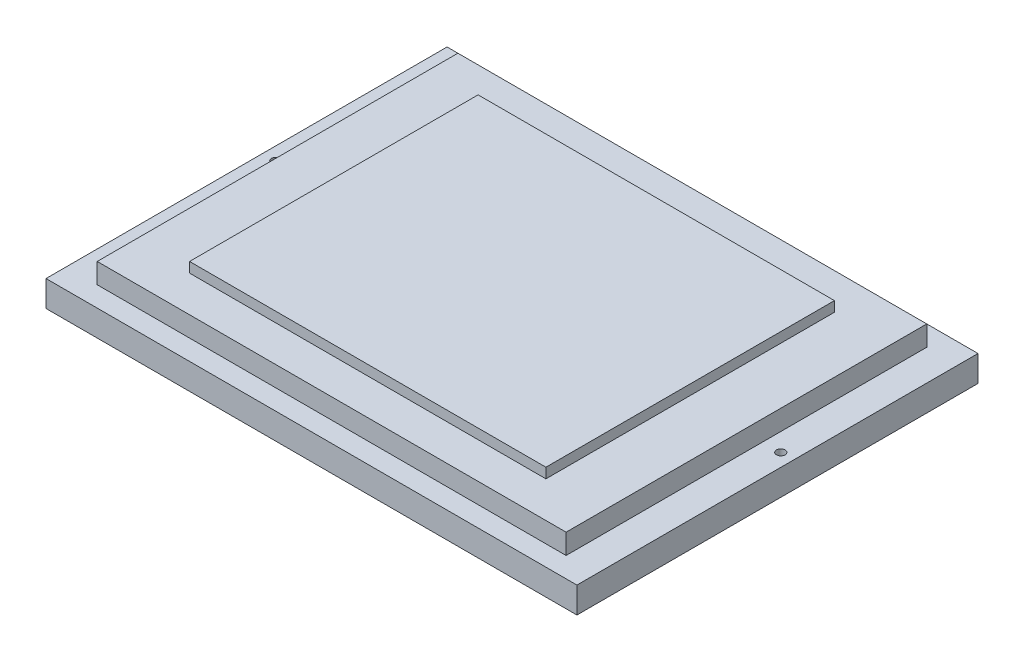
ISO-10303-21;
HEADER;
FILE_DESCRIPTION(('STEP AP214'),'2;1');
FILE_NAME('part.step','',(''),(''),'','','');
FILE_SCHEMA(('AUTOMOTIVE_DESIGN { 1 0 10303 214 1 1 1 1 }'));
ENDSEC;
DATA;
#1=APPLICATION_CONTEXT('core data for automotive mechanical design processes');
#2=APPLICATION_PROTOCOL_DEFINITION('international standard','automotive_design',2000,#1);
#3=PRODUCT_CONTEXT('',#1,'mechanical');
#4=PRODUCT('Part','Part','',(#3));
#5=PRODUCT_RELATED_PRODUCT_CATEGORY('part','',(#4));
#6=PRODUCT_DEFINITION_FORMATION('','',#4);
#7=PRODUCT_DEFINITION_CONTEXT('part definition',#1,'design');
#8=PRODUCT_DEFINITION('design','',#6,#7);
#9=PRODUCT_DEFINITION_SHAPE('','',#8);
#10=(LENGTH_UNIT() NAMED_UNIT(*) SI_UNIT(.MILLI.,.METRE.));
#11=(NAMED_UNIT(*) PLANE_ANGLE_UNIT() SI_UNIT($,.RADIAN.));
#12=(NAMED_UNIT(*) SI_UNIT($,.STERADIAN.) SOLID_ANGLE_UNIT());
#13=UNCERTAINTY_MEASURE_WITH_UNIT(LENGTH_MEASURE(1.E-05),#10,'distance_accuracy_value','');
#14=(GEOMETRIC_REPRESENTATION_CONTEXT(3) GLOBAL_UNCERTAINTY_ASSIGNED_CONTEXT((#13)) GLOBAL_UNIT_ASSIGNED_CONTEXT((#10,
#11,#12)) REPRESENTATION_CONTEXT('',''));
#15=CARTESIAN_POINT('',(0.,0.,0.));
#16=DIRECTION('',(0.,0.,1.));
#17=DIRECTION('',(1.,0.,0.));
#18=AXIS2_PLACEMENT_3D('',#15,#16,#17);
#19=CARTESIAN_POINT('',(21.5,-21.,-264.));
#20=DIRECTION('',(-1.,0.,0.));
#21=DIRECTION('',(0.,0.,1.));
#22=AXIS2_PLACEMENT_3D('',#19,#20,#21);
#23=PLANE('',#22);
#24=DIRECTION('',(0.,1.,0.));
#25=VECTOR('',#24,1.);
#26=CARTESIAN_POINT('',(21.5,-21.,-14.));
#27=LINE('',#26,#25);
#28=CARTESIAN_POINT('',(21.5,-21.,-14.));
#29=VERTEX_POINT('',#28);
#30=CARTESIAN_POINT('',(21.5,-7.,-14.));
#31=VERTEX_POINT('',#30);
#32=EDGE_CURVE('E186',#29,#31,#27,.T.);
#33=ORIENTED_EDGE('',*,*,#32,.T.);
#34=DIRECTION('',(0.,0.,1.));
#35=VECTOR('',#34,1.);
#36=CARTESIAN_POINT('',(21.5,-7.,-264.));
#37=LINE('',#36,#35);
#38=CARTESIAN_POINT('',(21.5,-7.,-264.));
#39=VERTEX_POINT('',#38);
#40=EDGE_CURVE('E50',#39,#31,#37,.T.);
#41=ORIENTED_EDGE('',*,*,#40,.F.);
#42=DIRECTION('',(0.,1.,0.));
#43=VECTOR('',#42,1.);
#44=CARTESIAN_POINT('',(21.5,-21.,-264.));
#45=LINE('',#44,#43);
#46=CARTESIAN_POINT('',(21.5,-21.,-264.));
#47=VERTEX_POINT('',#46);
#48=EDGE_CURVE('E187',#47,#39,#45,.T.);
#49=ORIENTED_EDGE('',*,*,#48,.F.);
#50=DIRECTION('',(0.,0.,1.));
#51=VECTOR('',#50,1.);
#52=CARTESIAN_POINT('',(21.5,-21.,-264.));
#53=LINE('',#52,#51);
#54=EDGE_CURVE('E174',#47,#29,#53,.T.);
#55=ORIENTED_EDGE('',*,*,#54,.T.);
#56=EDGE_LOOP('',(#33,#41,#49,#55));
#57=FACE_BOUND('',#56,.T.);
#58=ADVANCED_FACE('F33',(#57),#23,.T.);
#59=CARTESIAN_POINT('',(21.5,-21.,-264.));
#60=DIRECTION('',(0.,0.,-1.));
#61=DIRECTION('',(-1.,0.,0.));
#62=AXIS2_PLACEMENT_3D('',#59,#60,#61);
#63=PLANE('',#62);
#64=ORIENTED_EDGE('',*,*,#48,.T.);
#65=DIRECTION('',(-1.,0.,0.));
#66=VECTOR('',#65,1.);
#67=CARTESIAN_POINT('',(21.5,-7.,-264.));
#68=LINE('',#67,#66);
#69=CARTESIAN_POINT('',(346.5,-7.,-264.));
#70=VERTEX_POINT('',#69);
#71=EDGE_CURVE('E172',#70,#39,#68,.T.);
#72=ORIENTED_EDGE('',*,*,#71,.F.);
#73=DIRECTION('',(0.,1.,0.));
#74=VECTOR('',#73,1.);
#75=CARTESIAN_POINT('',(346.5,-21.,-264.));
#76=LINE('',#75,#74);
#77=CARTESIAN_POINT('',(346.5,-21.,-264.));
#78=VERTEX_POINT('',#77);
#79=EDGE_CURVE('E191',#78,#70,#76,.T.);
#80=ORIENTED_EDGE('',*,*,#79,.F.);
#81=DIRECTION('',(-1.,0.,0.));
#82=VECTOR('',#81,1.);
#83=CARTESIAN_POINT('',(21.5,-21.,-264.));
#84=LINE('',#83,#82);
#85=EDGE_CURVE('E183',#78,#47,#84,.T.);
#86=ORIENTED_EDGE('',*,*,#85,.T.);
#87=EDGE_LOOP('',(#64,#72,#80,#86));
#88=FACE_BOUND('',#87,.T.);
#89=ADVANCED_FACE('F274',(#88),#63,.T.);
#90=CARTESIAN_POINT('',(346.5,-21.,-264.));
#91=DIRECTION('',(1.,0.,0.));
#92=DIRECTION('',(0.,0.,-1.));
#93=AXIS2_PLACEMENT_3D('',#90,#91,#92);
#94=PLANE('',#93);
#95=ORIENTED_EDGE('',*,*,#79,.T.);
#96=DIRECTION('',(0.,0.,-1.));
#97=VECTOR('',#96,1.);
#98=CARTESIAN_POINT('',(346.5,-7.,-264.));
#99=LINE('',#98,#97);
#100=CARTESIAN_POINT('',(346.5,-7.,-14.));
#101=VERTEX_POINT('',#100);
#102=EDGE_CURVE('E170',#101,#70,#99,.T.);
#103=ORIENTED_EDGE('',*,*,#102,.F.);
#104=DIRECTION('',(0.,1.,0.));
#105=VECTOR('',#104,1.);
#106=CARTESIAN_POINT('',(346.5,-21.,-14.));
#107=LINE('',#106,#105);
#108=CARTESIAN_POINT('',(346.5,-21.,-14.));
#109=VERTEX_POINT('',#108);
#110=EDGE_CURVE('E194',#109,#101,#107,.T.);
#111=ORIENTED_EDGE('',*,*,#110,.F.);
#112=DIRECTION('',(0.,0.,-1.));
#113=VECTOR('',#112,1.);
#114=CARTESIAN_POINT('',(346.5,-21.,-264.));
#115=LINE('',#114,#113);
#116=EDGE_CURVE('E180',#109,#78,#115,.T.);
#117=ORIENTED_EDGE('',*,*,#116,.T.);
#118=EDGE_LOOP('',(#95,#103,#111,#117));
#119=FACE_BOUND('',#118,.T.);
#120=ADVANCED_FACE('F279',(#119),#94,.T.);
#121=CARTESIAN_POINT('',(21.5,-21.,-14.));
#122=DIRECTION('',(0.,0.,1.));
#123=DIRECTION('',(1.,0.,0.));
#124=AXIS2_PLACEMENT_3D('',#121,#122,#123);
#125=PLANE('',#124);
#126=ORIENTED_EDGE('',*,*,#110,.T.);
#127=DIRECTION('',(1.,0.,0.));
#128=VECTOR('',#127,1.);
#129=CARTESIAN_POINT('',(21.5,-7.,-14.));
#130=LINE('',#129,#128);
#131=EDGE_CURVE('E168',#31,#101,#130,.T.);
#132=ORIENTED_EDGE('',*,*,#131,.F.);
#133=ORIENTED_EDGE('',*,*,#32,.F.);
#134=DIRECTION('',(1.,0.,0.));
#135=VECTOR('',#134,1.);
#136=CARTESIAN_POINT('',(21.5,-21.,-14.));
#137=LINE('',#136,#135);
#138=EDGE_CURVE('E177',#29,#109,#137,.T.);
#139=ORIENTED_EDGE('',*,*,#138,.T.);
#140=EDGE_LOOP('',(#126,#132,#133,#139));
#141=FACE_BOUND('',#140,.T.);
#142=ADVANCED_FACE('F283',(#141),#125,.T.);
#143=CARTESIAN_POINT('',(0.,-39.,0.));
#144=DIRECTION('',(-1.,0.,0.));
#145=DIRECTION('',(0.,0.,1.));
#146=AXIS2_PLACEMENT_3D('',#143,#144,#145);
#147=PLANE('',#146);
#148=DIRECTION('',(0.,1.,0.));
#149=VECTOR('',#148,1.);
#150=CARTESIAN_POINT('',(0.,-39.,0.));
#151=LINE('',#150,#149);
#152=CARTESIAN_POINT('',(0.,-39.,0.));
#153=VERTEX_POINT('',#152);
#154=CARTESIAN_POINT('',(0.,-21.,0.));
#155=VERTEX_POINT('',#154);
#156=EDGE_CURVE('E217',#153,#155,#151,.T.);
#157=ORIENTED_EDGE('',*,*,#156,.T.);
#158=DIRECTION('',(0.,0.,1.));
#159=VECTOR('',#158,1.);
#160=CARTESIAN_POINT('',(0.,-21.,-278.));
#161=LINE('',#160,#159);
#162=CARTESIAN_POINT('',(0.,-21.,-278.));
#163=VERTEX_POINT('',#162);
#164=EDGE_CURVE('E190',#163,#155,#161,.T.);
#165=ORIENTED_EDGE('',*,*,#164,.F.);
#166=DIRECTION('',(0.,1.,0.));
#167=VECTOR('',#166,1.);
#168=CARTESIAN_POINT('',(0.,-39.,-278.));
#169=LINE('',#168,#167);
#170=CARTESIAN_POINT('',(0.,-39.,-278.));
#171=VERTEX_POINT('',#170);
#172=EDGE_CURVE('E11',#171,#163,#169,.T.);
#173=ORIENTED_EDGE('',*,*,#172,.F.);
#174=DIRECTION('',(0.,0.,1.));
#175=VECTOR('',#174,1.);
#176=CARTESIAN_POINT('',(0.,-39.,0.));
#177=LINE('',#176,#175);
#178=EDGE_CURVE('E206',#171,#153,#177,.T.);
#179=ORIENTED_EDGE('',*,*,#178,.T.);
#180=EDGE_LOOP('',(#157,#165,#173,#179));
#181=FACE_BOUND('',#180,.T.);
#182=ADVANCED_FACE('F35',(#181),#147,.T.);
#183=CARTESIAN_POINT('',(0.,-39.,-278.));
#184=DIRECTION('',(0.,0.,-1.));
#185=DIRECTION('',(-1.,0.,0.));
#186=AXIS2_PLACEMENT_3D('',#183,#184,#185);
#187=PLANE('',#186);
#188=ORIENTED_EDGE('',*,*,#172,.T.);
#189=DIRECTION('',(-1.,0.,0.));
#190=VECTOR('',#189,1.);
#191=CARTESIAN_POINT('',(0.,-21.,-278.));
#192=LINE('',#191,#190);
#193=CARTESIAN_POINT('',(368.,-21.,-278.));
#194=VERTEX_POINT('',#193);
#195=EDGE_CURVE('E204',#194,#163,#192,.T.);
#196=ORIENTED_EDGE('',*,*,#195,.F.);
#197=DIRECTION('',(0.,1.,0.));
#198=VECTOR('',#197,1.);
#199=CARTESIAN_POINT('',(368.,-39.,-278.));
#200=LINE('',#199,#198);
#201=CARTESIAN_POINT('',(368.,-39.,-278.));
#202=VERTEX_POINT('',#201);
#203=EDGE_CURVE('E42',#202,#194,#200,.T.);
#204=ORIENTED_EDGE('',*,*,#203,.F.);
#205=DIRECTION('',(-1.,0.,0.));
#206=VECTOR('',#205,1.);
#207=CARTESIAN_POINT('',(0.,-39.,-278.));
#208=LINE('',#207,#206);
#209=EDGE_CURVE('E215',#202,#171,#208,.T.);
#210=ORIENTED_EDGE('',*,*,#209,.T.);
#211=EDGE_LOOP('',(#188,#196,#204,#210));
#212=FACE_BOUND('',#211,.T.);
#213=ADVANCED_FACE('F254',(#212),#187,.T.);
#214=CARTESIAN_POINT('',(368.,-39.,0.));
#215=DIRECTION('',(1.,0.,0.));
#216=DIRECTION('',(0.,0.,-1.));
#217=AXIS2_PLACEMENT_3D('',#214,#215,#216);
#218=PLANE('',#217);
#219=ORIENTED_EDGE('',*,*,#203,.T.);
#220=DIRECTION('',(0.,0.,-1.));
#221=VECTOR('',#220,1.);
#222=CARTESIAN_POINT('',(368.,-21.,-278.));
#223=LINE('',#222,#221);
#224=CARTESIAN_POINT('',(368.,-21.,0.));
#225=VERTEX_POINT('',#224);
#226=EDGE_CURVE('E202',#225,#194,#223,.T.);
#227=ORIENTED_EDGE('',*,*,#226,.F.);
#228=DIRECTION('',(0.,1.,0.));
#229=VECTOR('',#228,1.);
#230=CARTESIAN_POINT('',(368.,-39.,0.));
#231=LINE('',#230,#229);
#232=CARTESIAN_POINT('',(368.,-39.,0.));
#233=VERTEX_POINT('',#232);
#234=EDGE_CURVE('E221',#233,#225,#231,.T.);
#235=ORIENTED_EDGE('',*,*,#234,.F.);
#236=DIRECTION('',(0.,0.,-1.));
#237=VECTOR('',#236,1.);
#238=CARTESIAN_POINT('',(368.,-39.,0.));
#239=LINE('',#238,#237);
#240=EDGE_CURVE('E212',#233,#202,#239,.T.);
#241=ORIENTED_EDGE('',*,*,#240,.T.);
#242=EDGE_LOOP('',(#219,#227,#235,#241));
#243=FACE_BOUND('',#242,.T.);
#244=ADVANCED_FACE('F258',(#243),#218,.T.);
#245=CARTESIAN_POINT('',(0.,-39.,0.));
#246=DIRECTION('',(0.,0.,1.));
#247=DIRECTION('',(1.,0.,0.));
#248=AXIS2_PLACEMENT_3D('',#245,#246,#247);
#249=PLANE('',#248);
#250=ORIENTED_EDGE('',*,*,#234,.T.);
#251=DIRECTION('',(1.,0.,0.));
#252=VECTOR('',#251,1.);
#253=CARTESIAN_POINT('',(0.,-21.,0.));
#254=LINE('',#253,#252);
#255=EDGE_CURVE('E200',#155,#225,#254,.T.);
#256=ORIENTED_EDGE('',*,*,#255,.F.);
#257=ORIENTED_EDGE('',*,*,#156,.F.);
#258=DIRECTION('',(1.,0.,0.));
#259=VECTOR('',#258,1.);
#260=CARTESIAN_POINT('',(0.,-39.,0.));
#261=LINE('',#260,#259);
#262=EDGE_CURVE('E209',#153,#233,#261,.T.);
#263=ORIENTED_EDGE('',*,*,#262,.T.);
#264=EDGE_LOOP('',(#250,#256,#257,#263));
#265=FACE_BOUND('',#264,.T.);
#266=ADVANCED_FACE('F245',(#265),#249,.T.);
#267=CARTESIAN_POINT('',(0.,-39.,0.));
#268=DIRECTION('',(0.,-1.,0.));
#269=DIRECTION('',(0.,0.,-1.));
#270=AXIS2_PLACEMENT_3D('',#267,#268,#269);
#271=PLANE('',#270);
#272=CARTESIAN_POINT('',(9.00000000000001,-39.,-150.3));
#273=DIRECTION('',(0.,-1.,0.));
#274=DIRECTION('',(0.,0.,-1.));
#275=AXIS2_PLACEMENT_3D('',#272,#273,#274);
#276=CIRCLE('',#275,3.);
#277=CARTESIAN_POINT('',(9.00000000000001,-39.,-153.3));
#278=VERTEX_POINT('',#277);
#279=EDGE_CURVE('E154',#278,#278,#276,.T.);
#280=ORIENTED_EDGE('',*,*,#279,.F.);
#281=EDGE_LOOP('',(#280));
#282=FACE_BOUND('',#281,.T.);
#283=CARTESIAN_POINT('',(359.,-39.,-150.3));
#284=DIRECTION('',(0.,-1.,0.));
#285=DIRECTION('',(0.,0.,-1.));
#286=AXIS2_PLACEMENT_3D('',#283,#284,#285);
#287=CIRCLE('',#286,2.99999999999999);
#288=CARTESIAN_POINT('',(359.,-39.,-153.3));
#289=VERTEX_POINT('',#288);
#290=EDGE_CURVE('E227',#289,#289,#287,.T.);
#291=ORIENTED_EDGE('',*,*,#290,.F.);
#292=EDGE_LOOP('',(#291));
#293=FACE_BOUND('',#292,.T.);
#294=ORIENTED_EDGE('',*,*,#178,.F.);
#295=ORIENTED_EDGE('',*,*,#209,.F.);
#296=ORIENTED_EDGE('',*,*,#240,.F.);
#297=ORIENTED_EDGE('',*,*,#262,.F.);
#298=EDGE_LOOP('',(#294,#295,#296,#297));
#299=FACE_BOUND('',#298,.T.);
#300=ADVANCED_FACE('F241',(#282,#293,#299),#271,.T.);
#301=CARTESIAN_POINT('',(0.,-21.,0.));
#302=DIRECTION('',(0.,1.,0.));
#303=DIRECTION('',(0.,0.,1.));
#304=AXIS2_PLACEMENT_3D('',#301,#302,#303);
#305=PLANE('',#304);
#306=CARTESIAN_POINT('',(9.00000000000001,-21.,-150.3));
#307=DIRECTION('',(0.,1.,0.));
#308=DIRECTION('',(0.,0.,1.));
#309=AXIS2_PLACEMENT_3D('',#306,#307,#308);
#310=CIRCLE('',#309,3.);
#311=CARTESIAN_POINT('',(9.00000000000001,-21.,-147.3));
#312=VERTEX_POINT('',#311);
#313=EDGE_CURVE('E37',#312,#312,#310,.T.);
#314=ORIENTED_EDGE('',*,*,#313,.F.);
#315=EDGE_LOOP('',(#314));
#316=FACE_BOUND('',#315,.T.);
#317=CARTESIAN_POINT('',(359.,-21.,-150.3));
#318=DIRECTION('',(0.,1.,0.));
#319=DIRECTION('',(0.,0.,1.));
#320=AXIS2_PLACEMENT_3D('',#317,#318,#319);
#321=CIRCLE('',#320,2.99999999999999);
#322=CARTESIAN_POINT('',(359.,-21.,-147.3));
#323=VERTEX_POINT('',#322);
#324=EDGE_CURVE('E225',#323,#323,#321,.T.);
#325=ORIENTED_EDGE('',*,*,#324,.F.);
#326=EDGE_LOOP('',(#325));
#327=FACE_BOUND('',#326,.T.);
#328=ORIENTED_EDGE('',*,*,#85,.F.);
#329=ORIENTED_EDGE('',*,*,#116,.F.);
#330=ORIENTED_EDGE('',*,*,#138,.F.);
#331=ORIENTED_EDGE('',*,*,#54,.F.);
#332=EDGE_LOOP('',(#328,#329,#330,#331));
#333=FACE_BOUND('',#332,.T.);
#334=ORIENTED_EDGE('',*,*,#164,.T.);
#335=ORIENTED_EDGE('',*,*,#255,.T.);
#336=ORIENTED_EDGE('',*,*,#226,.T.);
#337=ORIENTED_EDGE('',*,*,#195,.T.);
#338=EDGE_LOOP('',(#334,#335,#336,#337));
#339=FACE_BOUND('',#338,.T.);
#340=ADVANCED_FACE('F244',(#316,#327,#333,#339),#305,.T.);
#341=CARTESIAN_POINT('',(0.,-7.,0.));
#342=DIRECTION('',(0.,1.,0.));
#343=DIRECTION('',(0.,0.,1.));
#344=AXIS2_PLACEMENT_3D('',#341,#342,#343);
#345=PLANE('',#344);
#346=DIRECTION('',(-1.,0.,0.));
#347=VECTOR('',#346,1.);
#348=CARTESIAN_POINT('',(60.5,-7.,-239.));
#349=LINE('',#348,#347);
#350=CARTESIAN_POINT('',(307.5,-7.,-239.));
#351=VERTEX_POINT('',#350);
#352=CARTESIAN_POINT('',(60.5,-7.,-239.));
#353=VERTEX_POINT('',#352);
#354=EDGE_CURVE('E136',#351,#353,#349,.T.);
#355=ORIENTED_EDGE('',*,*,#354,.F.);
#356=DIRECTION('',(0.,0.,-1.));
#357=VECTOR('',#356,1.);
#358=CARTESIAN_POINT('',(307.5,-7.,-239.));
#359=LINE('',#358,#357);
#360=CARTESIAN_POINT('',(307.5,-7.,-39.));
#361=VERTEX_POINT('',#360);
#362=EDGE_CURVE('E145',#361,#351,#359,.T.);
#363=ORIENTED_EDGE('',*,*,#362,.F.);
#364=DIRECTION('',(1.,0.,0.));
#365=VECTOR('',#364,1.);
#366=CARTESIAN_POINT('',(60.5,-7.,-39.));
#367=LINE('',#366,#365);
#368=CARTESIAN_POINT('',(60.5,-7.,-39.));
#369=VERTEX_POINT('',#368);
#370=EDGE_CURVE('E128',#369,#361,#367,.T.);
#371=ORIENTED_EDGE('',*,*,#370,.F.);
#372=DIRECTION('',(0.,0.,1.));
#373=VECTOR('',#372,1.);
#374=CARTESIAN_POINT('',(60.5,-7.,-239.));
#375=LINE('',#374,#373);
#376=EDGE_CURVE('E142',#353,#369,#375,.T.);
#377=ORIENTED_EDGE('',*,*,#376,.F.);
#378=EDGE_LOOP('',(#355,#363,#371,#377));
#379=FACE_BOUND('',#378,.T.);
#380=ORIENTED_EDGE('',*,*,#40,.T.);
#381=ORIENTED_EDGE('',*,*,#131,.T.);
#382=ORIENTED_EDGE('',*,*,#102,.T.);
#383=ORIENTED_EDGE('',*,*,#71,.T.);
#384=EDGE_LOOP('',(#380,#381,#382,#383));
#385=FACE_BOUND('',#384,.T.);
#386=ADVANCED_FACE('F141',(#379,#385),#345,.T.);
#387=CARTESIAN_POINT('',(60.5,-7.,-239.));
#388=DIRECTION('',(-1.,0.,0.));
#389=DIRECTION('',(0.,0.,1.));
#390=AXIS2_PLACEMENT_3D('',#387,#388,#389);
#391=PLANE('',#390);
#392=DIRECTION('',(0.,0.,1.));
#393=VECTOR('',#392,1.);
#394=CARTESIAN_POINT('',(60.5,0.,-239.));
#395=LINE('',#394,#393);
#396=CARTESIAN_POINT('',(60.5,0.,-239.));
#397=VERTEX_POINT('',#396);
#398=CARTESIAN_POINT('',(60.5,0.,-39.));
#399=VERTEX_POINT('',#398);
#400=EDGE_CURVE('E159',#397,#399,#395,.T.);
#401=ORIENTED_EDGE('',*,*,#400,.F.);
#402=DIRECTION('',(0.,1.,0.));
#403=VECTOR('',#402,1.);
#404=CARTESIAN_POINT('',(60.5,-7.,-239.));
#405=LINE('',#404,#403);
#406=EDGE_CURVE('E148',#353,#397,#405,.T.);
#407=ORIENTED_EDGE('',*,*,#406,.F.);
#408=ORIENTED_EDGE('',*,*,#376,.T.);
#409=DIRECTION('',(0.,1.,0.));
#410=VECTOR('',#409,1.);
#411=CARTESIAN_POINT('',(60.5,-7.,-39.));
#412=LINE('',#411,#410);
#413=EDGE_CURVE('E125',#369,#399,#412,.T.);
#414=ORIENTED_EDGE('',*,*,#413,.T.);
#415=EDGE_LOOP('',(#401,#407,#408,#414));
#416=FACE_BOUND('',#415,.T.);
#417=ADVANCED_FACE('F147',(#416),#391,.T.);
#418=CARTESIAN_POINT('',(60.5,-7.,-239.));
#419=DIRECTION('',(0.,0.,-1.));
#420=DIRECTION('',(-1.,0.,0.));
#421=AXIS2_PLACEMENT_3D('',#418,#419,#420);
#422=PLANE('',#421);
#423=DIRECTION('',(-1.,0.,0.));
#424=VECTOR('',#423,1.);
#425=CARTESIAN_POINT('',(60.5,0.,-239.));
#426=LINE('',#425,#424);
#427=CARTESIAN_POINT('',(307.5,0.,-239.));
#428=VERTEX_POINT('',#427);
#429=EDGE_CURVE('E149',#428,#397,#426,.T.);
#430=ORIENTED_EDGE('',*,*,#429,.F.);
#431=DIRECTION('',(0.,1.,0.));
#432=VECTOR('',#431,1.);
#433=CARTESIAN_POINT('',(307.5,-7.,-239.));
#434=LINE('',#433,#432);
#435=EDGE_CURVE('E164',#351,#428,#434,.T.);
#436=ORIENTED_EDGE('',*,*,#435,.F.);
#437=ORIENTED_EDGE('',*,*,#354,.T.);
#438=ORIENTED_EDGE('',*,*,#406,.T.);
#439=EDGE_LOOP('',(#430,#436,#437,#438));
#440=FACE_BOUND('',#439,.T.);
#441=ADVANCED_FACE('F292',(#440),#422,.T.);
#442=CARTESIAN_POINT('',(307.5,-7.,-239.));
#443=DIRECTION('',(1.,0.,0.));
#444=DIRECTION('',(0.,0.,-1.));
#445=AXIS2_PLACEMENT_3D('',#442,#443,#444);
#446=PLANE('',#445);
#447=DIRECTION('',(0.,0.,-1.));
#448=VECTOR('',#447,1.);
#449=CARTESIAN_POINT('',(307.5,0.,-239.));
#450=LINE('',#449,#448);
#451=CARTESIAN_POINT('',(307.5,0.,-39.));
#452=VERTEX_POINT('',#451);
#453=EDGE_CURVE('E58',#452,#428,#450,.T.);
#454=ORIENTED_EDGE('',*,*,#453,.F.);
#455=DIRECTION('',(0.,1.,0.));
#456=VECTOR('',#455,1.);
#457=CARTESIAN_POINT('',(307.5,-7.,-39.));
#458=LINE('',#457,#456);
#459=EDGE_CURVE('E135',#361,#452,#458,.T.);
#460=ORIENTED_EDGE('',*,*,#459,.F.);
#461=ORIENTED_EDGE('',*,*,#362,.T.);
#462=ORIENTED_EDGE('',*,*,#435,.T.);
#463=EDGE_LOOP('',(#454,#460,#461,#462));
#464=FACE_BOUND('',#463,.T.);
#465=ADVANCED_FACE('F296',(#464),#446,.T.);
#466=CARTESIAN_POINT('',(60.5,-7.,-39.));
#467=DIRECTION('',(0.,0.,1.));
#468=DIRECTION('',(1.,0.,0.));
#469=AXIS2_PLACEMENT_3D('',#466,#467,#468);
#470=PLANE('',#469);
#471=DIRECTION('',(1.,0.,0.));
#472=VECTOR('',#471,1.);
#473=CARTESIAN_POINT('',(60.5,0.,-39.));
#474=LINE('',#473,#472);
#475=EDGE_CURVE('E130',#399,#452,#474,.T.);
#476=ORIENTED_EDGE('',*,*,#475,.F.);
#477=ORIENTED_EDGE('',*,*,#413,.F.);
#478=ORIENTED_EDGE('',*,*,#370,.T.);
#479=ORIENTED_EDGE('',*,*,#459,.T.);
#480=EDGE_LOOP('',(#476,#477,#478,#479));
#481=FACE_BOUND('',#480,.T.);
#482=ADVANCED_FACE('F127',(#481),#470,.T.);
#483=CARTESIAN_POINT('',(0.,0.,0.));
#484=DIRECTION('',(0.,-1.,0.));
#485=DIRECTION('',(0.,0.,-1.));
#486=AXIS2_PLACEMENT_3D('',#483,#484,#485);
#487=PLANE('',#486);
#488=ORIENTED_EDGE('',*,*,#400,.T.);
#489=ORIENTED_EDGE('',*,*,#475,.T.);
#490=ORIENTED_EDGE('',*,*,#453,.T.);
#491=ORIENTED_EDGE('',*,*,#429,.T.);
#492=EDGE_LOOP('',(#488,#489,#490,#491));
#493=FACE_BOUND('',#492,.T.);
#494=ADVANCED_FACE('F295',(#493),#487,.F.);
#495=CARTESIAN_POINT('',(359.,-59.,-150.3));
#496=DIRECTION('',(0.,1.,0.));
#497=DIRECTION('',(0.,0.,1.));
#498=AXIS2_PLACEMENT_3D('',#495,#496,#497);
#499=CYLINDRICAL_SURFACE('',#498,2.99999999999999);
#500=ORIENTED_EDGE('',*,*,#290,.T.);
#501=EDGE_LOOP('',(#500));
#502=FACE_BOUND('',#501,.T.);
#503=ORIENTED_EDGE('',*,*,#324,.T.);
#504=EDGE_LOOP('',(#503));
#505=FACE_BOUND('',#504,.T.);
#506=ADVANCED_FACE('F302',(#502,#505),#499,.F.);
#507=CARTESIAN_POINT('',(9.00000000000001,-59.,-150.3));
#508=DIRECTION('',(0.,1.,0.));
#509=DIRECTION('',(0.,0.,1.));
#510=AXIS2_PLACEMENT_3D('',#507,#508,#509);
#511=CYLINDRICAL_SURFACE('',#510,3.);
#512=ORIENTED_EDGE('',*,*,#279,.T.);
#513=EDGE_LOOP('',(#512));
#514=FACE_BOUND('',#513,.T.);
#515=ORIENTED_EDGE('',*,*,#313,.T.);
#516=EDGE_LOOP('',(#515));
#517=FACE_BOUND('',#516,.T.);
#518=ADVANCED_FACE('F239',(#514,#517),#511,.F.);
#519=CLOSED_SHELL('',(#58,#89,#120,#142,#182,#213,#244,#266,#300,#340,#386,#417,#441,#465,#482,
#494,#506,#518));
#520=MANIFOLD_SOLID_BREP('B2',#519);
#521=ADVANCED_BREP_SHAPE_REPRESENTATION('',(#18,#520),#14);
#522=SHAPE_DEFINITION_REPRESENTATION(#9,#521);
ENDSEC;
END-ISO-10303-21;
